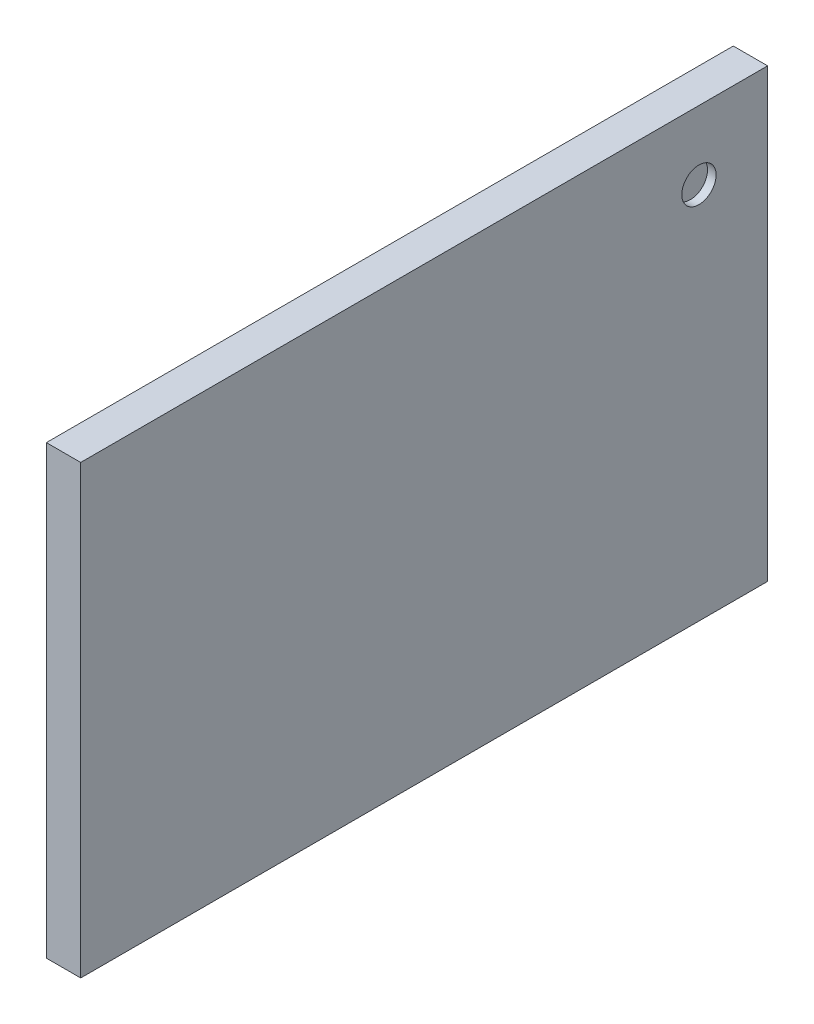
ISO-10303-21;
HEADER;
FILE_DESCRIPTION(('STEP AP214'),'2;1');
FILE_NAME('part.step','',(''),(''),'','','');
FILE_SCHEMA(('AUTOMOTIVE_DESIGN { 1 0 10303 214 1 1 1 1 }'));
ENDSEC;
DATA;
#1=APPLICATION_CONTEXT('core data for automotive mechanical design processes');
#2=APPLICATION_PROTOCOL_DEFINITION('international standard','automotive_design',2000,#1);
#3=PRODUCT_CONTEXT('',#1,'mechanical');
#4=PRODUCT('Part','Part','',(#3));
#5=PRODUCT_RELATED_PRODUCT_CATEGORY('part','',(#4));
#6=PRODUCT_DEFINITION_FORMATION('','',#4);
#7=PRODUCT_DEFINITION_CONTEXT('part definition',#1,'design');
#8=PRODUCT_DEFINITION('design','',#6,#7);
#9=PRODUCT_DEFINITION_SHAPE('','',#8);
#10=(LENGTH_UNIT() NAMED_UNIT(*) SI_UNIT(.MILLI.,.METRE.));
#11=(NAMED_UNIT(*) PLANE_ANGLE_UNIT() SI_UNIT($,.RADIAN.));
#12=(NAMED_UNIT(*) SI_UNIT($,.STERADIAN.) SOLID_ANGLE_UNIT());
#13=UNCERTAINTY_MEASURE_WITH_UNIT(LENGTH_MEASURE(1.E-05),#10,'distance_accuracy_value','');
#14=(GEOMETRIC_REPRESENTATION_CONTEXT(3) GLOBAL_UNCERTAINTY_ASSIGNED_CONTEXT((#13)) GLOBAL_UNIT_ASSIGNED_CONTEXT((#10,
#11,#12)) REPRESENTATION_CONTEXT('',''));
#15=CARTESIAN_POINT('',(0.,0.,0.));
#16=DIRECTION('',(0.,0.,1.));
#17=DIRECTION('',(1.,0.,0.));
#18=AXIS2_PLACEMENT_3D('',#15,#16,#17);
#19=CARTESIAN_POINT('',(25.4,26.8007352941176,466.818382352941));
#20=DIRECTION('',(0.,0.,-1.));
#21=DIRECTION('',(0.,1.,0.));
#22=AXIS2_PLACEMENT_3D('',#19,#20,#21);
#23=PLANE('',#22);
#24=DIRECTION('',(0.,-1.,0.));
#25=VECTOR('',#24,1.);
#26=CARTESIAN_POINT('',(0.,26.8007352941176,466.818382352941));
#27=LINE('',#26,#25);
#28=CARTESIAN_POINT('',(0.,26.8007352941176,466.818382352941));
#29=VERTEX_POINT('',#28);
#30=CARTESIAN_POINT('',(0.,-303.399264705882,466.818382352941));
#31=VERTEX_POINT('',#30);
#32=EDGE_CURVE('E101',#29,#31,#27,.T.);
#33=ORIENTED_EDGE('',*,*,#32,.T.);
#34=DIRECTION('',(-1.,0.,0.));
#35=VECTOR('',#34,1.);
#36=CARTESIAN_POINT('',(25.4,-303.399264705882,466.818382352941));
#37=LINE('',#36,#35);
#38=CARTESIAN_POINT('',(25.4,-303.399264705882,466.818382352941));
#39=VERTEX_POINT('',#38);
#40=EDGE_CURVE('E11',#39,#31,#37,.T.);
#41=ORIENTED_EDGE('',*,*,#40,.F.);
#42=DIRECTION('',(0.,-1.,0.));
#43=VECTOR('',#42,1.);
#44=CARTESIAN_POINT('',(25.4,26.8007352941176,466.818382352941));
#45=LINE('',#44,#43);
#46=CARTESIAN_POINT('',(25.4,26.8007352941176,466.818382352941));
#47=VERTEX_POINT('',#46);
#48=EDGE_CURVE('E89',#47,#39,#45,.T.);
#49=ORIENTED_EDGE('',*,*,#48,.F.);
#50=DIRECTION('',(-1.,0.,0.));
#51=VECTOR('',#50,1.);
#52=CARTESIAN_POINT('',(25.4,26.8007352941176,466.818382352941));
#53=LINE('',#52,#51);
#54=EDGE_CURVE('E97',#47,#29,#53,.T.);
#55=ORIENTED_EDGE('',*,*,#54,.T.);
#56=EDGE_LOOP('',(#33,#41,#49,#55));
#57=FACE_BOUND('',#56,.T.);
#58=ADVANCED_FACE('F38',(#57),#23,.F.);
#59=CARTESIAN_POINT('',(25.4,-303.399264705882,466.818382352941));
#60=DIRECTION('',(0.,1.,0.));
#61=DIRECTION('',(0.,0.,1.));
#62=AXIS2_PLACEMENT_3D('',#59,#60,#61);
#63=PLANE('',#62);
#64=DIRECTION('',(0.,0.,-1.));
#65=VECTOR('',#64,1.);
#66=CARTESIAN_POINT('',(0.,-303.399264705882,466.818382352941));
#67=LINE('',#66,#65);
#68=CARTESIAN_POINT('',(0.,-303.399264705882,-41.1816176470589));
#69=VERTEX_POINT('',#68);
#70=EDGE_CURVE('E93',#31,#69,#67,.T.);
#71=ORIENTED_EDGE('',*,*,#70,.T.);
#72=DIRECTION('',(-1.,0.,0.));
#73=VECTOR('',#72,1.);
#74=CARTESIAN_POINT('',(25.4,-303.399264705882,-41.1816176470589));
#75=LINE('',#74,#73);
#76=CARTESIAN_POINT('',(25.4,-303.399264705882,-41.1816176470589));
#77=VERTEX_POINT('',#76);
#78=EDGE_CURVE('E46',#77,#69,#75,.T.);
#79=ORIENTED_EDGE('',*,*,#78,.F.);
#80=DIRECTION('',(0.,0.,-1.));
#81=VECTOR('',#80,1.);
#82=CARTESIAN_POINT('',(25.4,-303.399264705882,466.818382352941));
#83=LINE('',#82,#81);
#84=EDGE_CURVE('E84',#39,#77,#83,.T.);
#85=ORIENTED_EDGE('',*,*,#84,.F.);
#86=ORIENTED_EDGE('',*,*,#40,.T.);
#87=EDGE_LOOP('',(#71,#79,#85,#86));
#88=FACE_BOUND('',#87,.T.);
#89=ADVANCED_FACE('F92',(#88),#63,.F.);
#90=CARTESIAN_POINT('',(25.4,26.8007352941176,-41.1816176470588));
#91=DIRECTION('',(0.,0.,1.));
#92=DIRECTION('',(0.,-1.,0.));
#93=AXIS2_PLACEMENT_3D('',#90,#91,#92);
#94=PLANE('',#93);
#95=DIRECTION('',(0.,1.,0.));
#96=VECTOR('',#95,1.);
#97=CARTESIAN_POINT('',(0.,26.8007352941176,-41.1816176470588));
#98=LINE('',#97,#96);
#99=CARTESIAN_POINT('',(0.,26.8007352941176,-41.1816176470588));
#100=VERTEX_POINT('',#99);
#101=EDGE_CURVE('E71',#69,#100,#98,.T.);
#102=ORIENTED_EDGE('',*,*,#101,.T.);
#103=DIRECTION('',(-1.,0.,0.));
#104=VECTOR('',#103,1.);
#105=CARTESIAN_POINT('',(25.4,26.8007352941176,-41.1816176470588));
#106=LINE('',#105,#104);
#107=CARTESIAN_POINT('',(25.4,26.8007352941176,-41.1816176470588));
#108=VERTEX_POINT('',#107);
#109=EDGE_CURVE('E94',#108,#100,#106,.T.);
#110=ORIENTED_EDGE('',*,*,#109,.F.);
#111=DIRECTION('',(0.,1.,0.));
#112=VECTOR('',#111,1.);
#113=CARTESIAN_POINT('',(25.4,26.8007352941176,-41.1816176470588));
#114=LINE('',#113,#112);
#115=EDGE_CURVE('E87',#77,#108,#114,.T.);
#116=ORIENTED_EDGE('',*,*,#115,.F.);
#117=ORIENTED_EDGE('',*,*,#78,.T.);
#118=EDGE_LOOP('',(#102,#110,#116,#117));
#119=FACE_BOUND('',#118,.T.);
#120=ADVANCED_FACE('F95',(#119),#94,.F.);
#121=CARTESIAN_POINT('',(25.4,26.8007352941176,466.818382352941));
#122=DIRECTION('',(0.,-1.,0.));
#123=DIRECTION('',(0.,0.,-1.));
#124=AXIS2_PLACEMENT_3D('',#121,#122,#123);
#125=PLANE('',#124);
#126=DIRECTION('',(0.,0.,1.));
#127=VECTOR('',#126,1.);
#128=CARTESIAN_POINT('',(0.,26.8007352941176,466.818382352941));
#129=LINE('',#128,#127);
#130=EDGE_CURVE('E77',#100,#29,#129,.T.);
#131=ORIENTED_EDGE('',*,*,#130,.T.);
#132=ORIENTED_EDGE('',*,*,#54,.F.);
#133=DIRECTION('',(0.,0.,1.));
#134=VECTOR('',#133,1.);
#135=CARTESIAN_POINT('',(25.4,26.8007352941176,466.818382352941));
#136=LINE('',#135,#134);
#137=EDGE_CURVE('E54',#108,#47,#136,.T.);
#138=ORIENTED_EDGE('',*,*,#137,.F.);
#139=ORIENTED_EDGE('',*,*,#109,.T.);
#140=EDGE_LOOP('',(#131,#132,#138,#139));
#141=FACE_BOUND('',#140,.T.);
#142=ADVANCED_FACE('F109',(#141),#125,.F.);
#143=CARTESIAN_POINT('',(25.4,0.,0.));
#144=DIRECTION('',(1.,0.,0.));
#145=DIRECTION('',(0.,0.,-1.));
#146=AXIS2_PLACEMENT_3D('',#143,#144,#145);
#147=PLANE('',#146);
#148=CARTESIAN_POINT('',(25.4,-23.9992647058824,9.61838235294114));
#149=DIRECTION('',(1.,0.,0.));
#150=DIRECTION('',(0.,0.,-1.));
#151=AXIS2_PLACEMENT_3D('',#148,#149,#150);
#152=CIRCLE('',#151,12.7);
#153=CARTESIAN_POINT('',(25.4,-23.9992647058824,-3.08161764705886));
#154=VERTEX_POINT('',#153);
#155=EDGE_CURVE('E115',#154,#154,#152,.T.);
#156=ORIENTED_EDGE('',*,*,#155,.F.);
#157=EDGE_LOOP('',(#156));
#158=FACE_BOUND('',#157,.T.);
#159=ORIENTED_EDGE('',*,*,#48,.T.);
#160=ORIENTED_EDGE('',*,*,#84,.T.);
#161=ORIENTED_EDGE('',*,*,#115,.T.);
#162=ORIENTED_EDGE('',*,*,#137,.T.);
#163=EDGE_LOOP('',(#159,#160,#161,#162));
#164=FACE_BOUND('',#163,.T.);
#165=ADVANCED_FACE('F85',(#158,#164),#147,.T.);
#166=CARTESIAN_POINT('',(0.,0.,0.));
#167=DIRECTION('',(1.,0.,0.));
#168=DIRECTION('',(0.,0.,-1.));
#169=AXIS2_PLACEMENT_3D('',#166,#167,#168);
#170=PLANE('',#169);
#171=ORIENTED_EDGE('',*,*,#32,.F.);
#172=ORIENTED_EDGE('',*,*,#130,.F.);
#173=ORIENTED_EDGE('',*,*,#101,.F.);
#174=ORIENTED_EDGE('',*,*,#70,.F.);
#175=EDGE_LOOP('',(#171,#172,#173,#174));
#176=FACE_BOUND('',#175,.T.);
#177=ADVANCED_FACE('F112',(#176),#170,.F.);
#178=CARTESIAN_POINT('',(19.05,-23.9992647058824,9.61838235294114));
#179=DIRECTION('',(1.,0.,0.));
#180=DIRECTION('',(0.,0.,-1.));
#181=AXIS2_PLACEMENT_3D('',#178,#179,#180);
#182=CYLINDRICAL_SURFACE('',#181,12.7);
#183=CARTESIAN_POINT('',(19.05,-23.9992647058824,9.61838235294114));
#184=DIRECTION('',(1.,0.,0.));
#185=DIRECTION('',(0.,0.,-1.));
#186=AXIS2_PLACEMENT_3D('',#183,#184,#185);
#187=CIRCLE('',#186,12.7);
#188=CARTESIAN_POINT('',(19.05,-23.9992647058824,-3.08161764705886));
#189=VERTEX_POINT('',#188);
#190=EDGE_CURVE('E104',#189,#189,#187,.T.);
#191=ORIENTED_EDGE('',*,*,#190,.F.);
#192=EDGE_LOOP('',(#191));
#193=FACE_BOUND('',#192,.T.);
#194=ORIENTED_EDGE('',*,*,#155,.T.);
#195=EDGE_LOOP('',(#194));
#196=FACE_BOUND('',#195,.T.);
#197=ADVANCED_FACE('F123',(#193,#196),#182,.F.);
#198=CARTESIAN_POINT('',(19.05,-23.9992647058824,9.61838235294114));
#199=DIRECTION('',(1.,0.,0.));
#200=DIRECTION('',(0.,0.,-1.));
#201=AXIS2_PLACEMENT_3D('',#198,#199,#200);
#202=PLANE('',#201);
#203=ORIENTED_EDGE('',*,*,#190,.T.);
#204=EDGE_LOOP('',(#203));
#205=FACE_BOUND('',#204,.T.);
#206=ADVANCED_FACE('F121',(#205),#202,.T.);
#207=CLOSED_SHELL('',(#58,#89,#120,#142,#165,#177,#197,#206));
#208=MANIFOLD_SOLID_BREP('B2',#207);
#209=ADVANCED_BREP_SHAPE_REPRESENTATION('',(#18,#208),#14);
#210=SHAPE_DEFINITION_REPRESENTATION(#9,#209);
ENDSEC;
END-ISO-10303-21;
